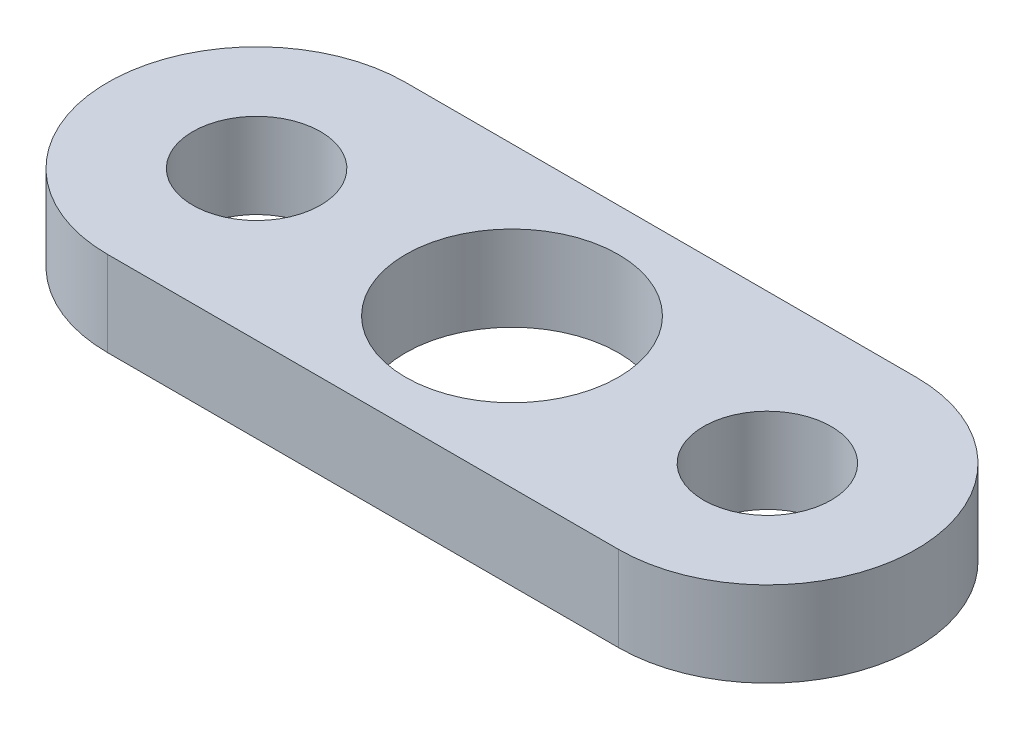
ISO-10303-21;
HEADER;
FILE_DESCRIPTION(('STEP AP214'),'2;1');
FILE_NAME('part.step','',(''),(''),'','','');
FILE_SCHEMA(('AUTOMOTIVE_DESIGN { 1 0 10303 214 1 1 1 1 }'));
ENDSEC;
DATA;
#1=APPLICATION_CONTEXT('core data for automotive mechanical design processes');
#2=APPLICATION_PROTOCOL_DEFINITION('international standard','automotive_design',2000,#1);
#3=PRODUCT_CONTEXT('',#1,'mechanical');
#4=PRODUCT('Part','Part','',(#3));
#5=PRODUCT_RELATED_PRODUCT_CATEGORY('part','',(#4));
#6=PRODUCT_DEFINITION_FORMATION('','',#4);
#7=PRODUCT_DEFINITION_CONTEXT('part definition',#1,'design');
#8=PRODUCT_DEFINITION('design','',#6,#7);
#9=PRODUCT_DEFINITION_SHAPE('','',#8);
#10=(LENGTH_UNIT() NAMED_UNIT(*) SI_UNIT(.MILLI.,.METRE.));
#11=(NAMED_UNIT(*) PLANE_ANGLE_UNIT() SI_UNIT($,.RADIAN.));
#12=(NAMED_UNIT(*) SI_UNIT($,.STERADIAN.) SOLID_ANGLE_UNIT());
#13=UNCERTAINTY_MEASURE_WITH_UNIT(LENGTH_MEASURE(1.E-05),#10,'distance_accuracy_value','');
#14=(GEOMETRIC_REPRESENTATION_CONTEXT(3) GLOBAL_UNCERTAINTY_ASSIGNED_CONTEXT((#13)) GLOBAL_UNIT_ASSIGNED_CONTEXT((#10,
#11,#12)) REPRESENTATION_CONTEXT('',''));
#15=CARTESIAN_POINT('',(0.,0.,0.));
#16=DIRECTION('',(0.,0.,1.));
#17=DIRECTION('',(1.,0.,0.));
#18=AXIS2_PLACEMENT_3D('',#15,#16,#17);
#19=CARTESIAN_POINT('',(-6.,2.,0.));
#20=DIRECTION('',(0.,1.,0.));
#21=DIRECTION('',(0.,0.,1.));
#22=AXIS2_PLACEMENT_3D('',#19,#20,#21);
#23=PLANE('',#22);
#24=CARTESIAN_POINT('',(-6.,2.,0.));
#25=DIRECTION('',(0.,1.,0.));
#26=DIRECTION('',(0.,0.,-1.));
#27=AXIS2_PLACEMENT_3D('',#24,#25,#26);
#28=CIRCLE('',#27,1.5);
#29=CARTESIAN_POINT('',(-6.,2.,-1.5));
#30=VERTEX_POINT('',#29);
#31=EDGE_CURVE('E136',#30,#30,#28,.T.);
#32=ORIENTED_EDGE('',*,*,#31,.F.);
#33=EDGE_LOOP('',(#32));
#34=FACE_BOUND('',#33,.T.);
#35=CARTESIAN_POINT('',(-6.,2.,0.));
#36=DIRECTION('',(0.,1.,0.));
#37=DIRECTION('',(0.,0.,1.));
#38=AXIS2_PLACEMENT_3D('',#35,#36,#37);
#39=CIRCLE('',#38,3.5);
#40=CARTESIAN_POINT('',(-6.,2.,-3.5));
#41=VERTEX_POINT('',#40);
#42=CARTESIAN_POINT('',(-6.,2.,3.5));
#43=VERTEX_POINT('',#42);
#44=EDGE_CURVE('E94',#41,#43,#39,.T.);
#45=ORIENTED_EDGE('',*,*,#44,.T.);
#46=DIRECTION('',(1.,0.,0.));
#47=VECTOR('',#46,1.);
#48=CARTESIAN_POINT('',(-6.,2.,3.5));
#49=LINE('',#48,#47);
#50=CARTESIAN_POINT('',(6.,2.,3.5));
#51=VERTEX_POINT('',#50);
#52=EDGE_CURVE('E89',#43,#51,#49,.T.);
#53=ORIENTED_EDGE('',*,*,#52,.T.);
#54=CARTESIAN_POINT('',(6.,2.,0.));
#55=DIRECTION('',(0.,1.,0.));
#56=DIRECTION('',(0.,0.,1.));
#57=AXIS2_PLACEMENT_3D('',#54,#55,#56);
#58=CIRCLE('',#57,3.5);
#59=CARTESIAN_POINT('',(6.,2.,-3.5));
#60=VERTEX_POINT('',#59);
#61=EDGE_CURVE('E92',#51,#60,#58,.T.);
#62=ORIENTED_EDGE('',*,*,#61,.T.);
#63=DIRECTION('',(-1.,0.,0.));
#64=VECTOR('',#63,1.);
#65=CARTESIAN_POINT('',(-6.,2.,-3.5));
#66=LINE('',#65,#64);
#67=EDGE_CURVE('E59',#60,#41,#66,.T.);
#68=ORIENTED_EDGE('',*,*,#67,.T.);
#69=EDGE_LOOP('',(#45,#53,#62,#68));
#70=FACE_BOUND('',#69,.T.);
#71=CARTESIAN_POINT('',(6.,2.,0.));
#72=DIRECTION('',(0.,1.,0.));
#73=DIRECTION('',(0.,0.,1.));
#74=AXIS2_PLACEMENT_3D('',#71,#72,#73);
#75=CIRCLE('',#74,1.5);
#76=CARTESIAN_POINT('',(6.,2.,1.5));
#77=VERTEX_POINT('',#76);
#78=EDGE_CURVE('E114',#77,#77,#75,.T.);
#79=ORIENTED_EDGE('',*,*,#78,.F.);
#80=EDGE_LOOP('',(#79));
#81=FACE_BOUND('',#80,.T.);
#82=CARTESIAN_POINT('',(0.,2.,0.));
#83=DIRECTION('',(0.,1.,0.));
#84=DIRECTION('',(0.,0.,1.));
#85=AXIS2_PLACEMENT_3D('',#82,#83,#84);
#86=CIRCLE('',#85,2.5);
#87=CARTESIAN_POINT('',(0.,2.,2.5));
#88=VERTEX_POINT('',#87);
#89=EDGE_CURVE('E144',#88,#88,#86,.T.);
#90=ORIENTED_EDGE('',*,*,#89,.F.);
#91=EDGE_LOOP('',(#90));
#92=FACE_BOUND('',#91,.T.);
#93=ADVANCED_FACE('F41',(#34,#70,#81,#92),#23,.T.);
#94=CARTESIAN_POINT('',(-6.,0.,0.));
#95=DIRECTION('',(0.,1.,0.));
#96=DIRECTION('',(0.,0.,1.));
#97=AXIS2_PLACEMENT_3D('',#94,#95,#96);
#98=PLANE('',#97);
#99=CARTESIAN_POINT('',(-6.,0.,0.));
#100=DIRECTION('',(0.,1.,0.));
#101=DIRECTION('',(0.,0.,1.));
#102=AXIS2_PLACEMENT_3D('',#99,#100,#101);
#103=CIRCLE('',#102,3.5);
#104=CARTESIAN_POINT('',(-6.,0.,-3.5));
#105=VERTEX_POINT('',#104);
#106=CARTESIAN_POINT('',(-6.,0.,3.5));
#107=VERTEX_POINT('',#106);
#108=EDGE_CURVE('E110',#105,#107,#103,.T.);
#109=ORIENTED_EDGE('',*,*,#108,.F.);
#110=DIRECTION('',(-1.,0.,0.));
#111=VECTOR('',#110,1.);
#112=CARTESIAN_POINT('',(-6.,0.,-3.5));
#113=LINE('',#112,#111);
#114=CARTESIAN_POINT('',(6.,0.,-3.5));
#115=VERTEX_POINT('',#114);
#116=EDGE_CURVE('E82',#115,#105,#113,.T.);
#117=ORIENTED_EDGE('',*,*,#116,.F.);
#118=CARTESIAN_POINT('',(6.,0.,0.));
#119=DIRECTION('',(0.,1.,0.));
#120=DIRECTION('',(0.,0.,1.));
#121=AXIS2_PLACEMENT_3D('',#118,#119,#120);
#122=CIRCLE('',#121,3.5);
#123=CARTESIAN_POINT('',(6.,0.,3.5));
#124=VERTEX_POINT('',#123);
#125=EDGE_CURVE('E76',#124,#115,#122,.T.);
#126=ORIENTED_EDGE('',*,*,#125,.F.);
#127=DIRECTION('',(1.,0.,0.));
#128=VECTOR('',#127,1.);
#129=CARTESIAN_POINT('',(-6.,0.,3.5));
#130=LINE('',#129,#128);
#131=EDGE_CURVE('E99',#107,#124,#130,.T.);
#132=ORIENTED_EDGE('',*,*,#131,.F.);
#133=EDGE_LOOP('',(#109,#117,#126,#132));
#134=FACE_BOUND('',#133,.T.);
#135=CARTESIAN_POINT('',(6.,0.,0.));
#136=DIRECTION('',(0.,1.,0.));
#137=DIRECTION('',(0.,0.,1.));
#138=AXIS2_PLACEMENT_3D('',#135,#136,#137);
#139=CIRCLE('',#138,1.5);
#140=CARTESIAN_POINT('',(6.,0.,1.5));
#141=VERTEX_POINT('',#140);
#142=EDGE_CURVE('E132',#141,#141,#139,.T.);
#143=ORIENTED_EDGE('',*,*,#142,.T.);
#144=EDGE_LOOP('',(#143));
#145=FACE_BOUND('',#144,.T.);
#146=CARTESIAN_POINT('',(-6.,0.,0.));
#147=DIRECTION('',(0.,1.,0.));
#148=DIRECTION('',(0.,0.,-1.));
#149=AXIS2_PLACEMENT_3D('',#146,#147,#148);
#150=CIRCLE('',#149,1.5);
#151=CARTESIAN_POINT('',(-6.,0.,-1.5));
#152=VERTEX_POINT('',#151);
#153=EDGE_CURVE('E140',#152,#152,#150,.T.);
#154=ORIENTED_EDGE('',*,*,#153,.T.);
#155=EDGE_LOOP('',(#154));
#156=FACE_BOUND('',#155,.T.);
#157=CARTESIAN_POINT('',(0.,0.,0.));
#158=DIRECTION('',(0.,1.,0.));
#159=DIRECTION('',(0.,0.,1.));
#160=AXIS2_PLACEMENT_3D('',#157,#158,#159);
#161=CIRCLE('',#160,2.5);
#162=CARTESIAN_POINT('',(0.,0.,2.5));
#163=VERTEX_POINT('',#162);
#164=EDGE_CURVE('E148',#163,#163,#161,.T.);
#165=ORIENTED_EDGE('',*,*,#164,.T.);
#166=EDGE_LOOP('',(#165));
#167=FACE_BOUND('',#166,.T.);
#168=ADVANCED_FACE('F127',(#134,#145,#156,#167),#98,.F.);
#169=CARTESIAN_POINT('',(-6.,2.,0.));
#170=DIRECTION('',(0.,-1.,0.));
#171=DIRECTION('',(0.,0.,-1.));
#172=AXIS2_PLACEMENT_3D('',#169,#170,#171);
#173=CYLINDRICAL_SURFACE('',#172,3.5);
#174=ORIENTED_EDGE('',*,*,#108,.T.);
#175=DIRECTION('',(0.,-1.,0.));
#176=VECTOR('',#175,1.);
#177=CARTESIAN_POINT('',(-6.,2.,3.5));
#178=LINE('',#177,#176);
#179=EDGE_CURVE('E11',#43,#107,#178,.T.);
#180=ORIENTED_EDGE('',*,*,#179,.F.);
#181=ORIENTED_EDGE('',*,*,#44,.F.);
#182=DIRECTION('',(0.,-1.,0.));
#183=VECTOR('',#182,1.);
#184=CARTESIAN_POINT('',(-6.,2.,-3.5));
#185=LINE('',#184,#183);
#186=EDGE_CURVE('E106',#41,#105,#185,.T.);
#187=ORIENTED_EDGE('',*,*,#186,.T.);
#188=EDGE_LOOP('',(#174,#180,#181,#187));
#189=FACE_BOUND('',#188,.T.);
#190=ADVANCED_FACE('F43',(#189),#173,.T.);
#191=CARTESIAN_POINT('',(-6.,2.,3.5));
#192=DIRECTION('',(0.,0.,-1.));
#193=DIRECTION('',(-1.,0.,0.));
#194=AXIS2_PLACEMENT_3D('',#191,#192,#193);
#195=PLANE('',#194);
#196=ORIENTED_EDGE('',*,*,#131,.T.);
#197=DIRECTION('',(0.,-1.,0.));
#198=VECTOR('',#197,1.);
#199=CARTESIAN_POINT('',(6.,2.,3.5));
#200=LINE('',#199,#198);
#201=EDGE_CURVE('E51',#51,#124,#200,.T.);
#202=ORIENTED_EDGE('',*,*,#201,.F.);
#203=ORIENTED_EDGE('',*,*,#52,.F.);
#204=ORIENTED_EDGE('',*,*,#179,.T.);
#205=EDGE_LOOP('',(#196,#202,#203,#204));
#206=FACE_BOUND('',#205,.T.);
#207=ADVANCED_FACE('F98',(#206),#195,.F.);
#208=CARTESIAN_POINT('',(6.,2.,0.));
#209=DIRECTION('',(0.,-1.,0.));
#210=DIRECTION('',(0.,0.,-1.));
#211=AXIS2_PLACEMENT_3D('',#208,#209,#210);
#212=CYLINDRICAL_SURFACE('',#211,3.5);
#213=ORIENTED_EDGE('',*,*,#125,.T.);
#214=DIRECTION('',(0.,-1.,0.));
#215=VECTOR('',#214,1.);
#216=CARTESIAN_POINT('',(6.,2.,-3.5));
#217=LINE('',#216,#215);
#218=EDGE_CURVE('E101',#60,#115,#217,.T.);
#219=ORIENTED_EDGE('',*,*,#218,.F.);
#220=ORIENTED_EDGE('',*,*,#61,.F.);
#221=ORIENTED_EDGE('',*,*,#201,.T.);
#222=EDGE_LOOP('',(#213,#219,#220,#221));
#223=FACE_BOUND('',#222,.T.);
#224=ADVANCED_FACE('F102',(#223),#212,.T.);
#225=CARTESIAN_POINT('',(-6.,2.,-3.5));
#226=DIRECTION('',(0.,0.,1.));
#227=DIRECTION('',(1.,0.,0.));
#228=AXIS2_PLACEMENT_3D('',#225,#226,#227);
#229=PLANE('',#228);
#230=ORIENTED_EDGE('',*,*,#116,.T.);
#231=ORIENTED_EDGE('',*,*,#186,.F.);
#232=ORIENTED_EDGE('',*,*,#67,.F.);
#233=ORIENTED_EDGE('',*,*,#218,.T.);
#234=EDGE_LOOP('',(#230,#231,#232,#233));
#235=FACE_BOUND('',#234,.T.);
#236=ADVANCED_FACE('F124',(#235),#229,.F.);
#237=CARTESIAN_POINT('',(6.,2.,0.));
#238=DIRECTION('',(0.,-1.,0.));
#239=DIRECTION('',(0.,0.,-1.));
#240=AXIS2_PLACEMENT_3D('',#237,#238,#239);
#241=CYLINDRICAL_SURFACE('',#240,1.5);
#242=ORIENTED_EDGE('',*,*,#78,.T.);
#243=EDGE_LOOP('',(#242));
#244=FACE_BOUND('',#243,.T.);
#245=ORIENTED_EDGE('',*,*,#142,.F.);
#246=EDGE_LOOP('',(#245));
#247=FACE_BOUND('',#246,.T.);
#248=ADVANCED_FACE('F168',(#244,#247),#241,.F.);
#249=CARTESIAN_POINT('',(-6.,2.,0.));
#250=DIRECTION('',(0.,-1.,0.));
#251=DIRECTION('',(0.,0.,-1.));
#252=AXIS2_PLACEMENT_3D('',#249,#250,#251);
#253=CYLINDRICAL_SURFACE('',#252,1.5);
#254=ORIENTED_EDGE('',*,*,#31,.T.);
#255=EDGE_LOOP('',(#254));
#256=FACE_BOUND('',#255,.T.);
#257=ORIENTED_EDGE('',*,*,#153,.F.);
#258=EDGE_LOOP('',(#257));
#259=FACE_BOUND('',#258,.T.);
#260=ADVANCED_FACE('F214',(#256,#259),#253,.F.);
#261=CARTESIAN_POINT('',(0.,2.,0.));
#262=DIRECTION('',(0.,-1.,0.));
#263=DIRECTION('',(0.,0.,-1.));
#264=AXIS2_PLACEMENT_3D('',#261,#262,#263);
#265=CYLINDRICAL_SURFACE('',#264,2.5);
#266=ORIENTED_EDGE('',*,*,#89,.T.);
#267=EDGE_LOOP('',(#266));
#268=FACE_BOUND('',#267,.T.);
#269=ORIENTED_EDGE('',*,*,#164,.F.);
#270=EDGE_LOOP('',(#269));
#271=FACE_BOUND('',#270,.T.);
#272=ADVANCED_FACE('F156',(#268,#271),#265,.F.);
#273=CLOSED_SHELL('',(#93,#168,#190,#207,#224,#236,#248,#260,#272));
#274=MANIFOLD_SOLID_BREP('B2',#273);
#275=ADVANCED_BREP_SHAPE_REPRESENTATION('',(#18,#274),#14);
#276=SHAPE_DEFINITION_REPRESENTATION(#9,#275);
ENDSEC;
END-ISO-10303-21;
